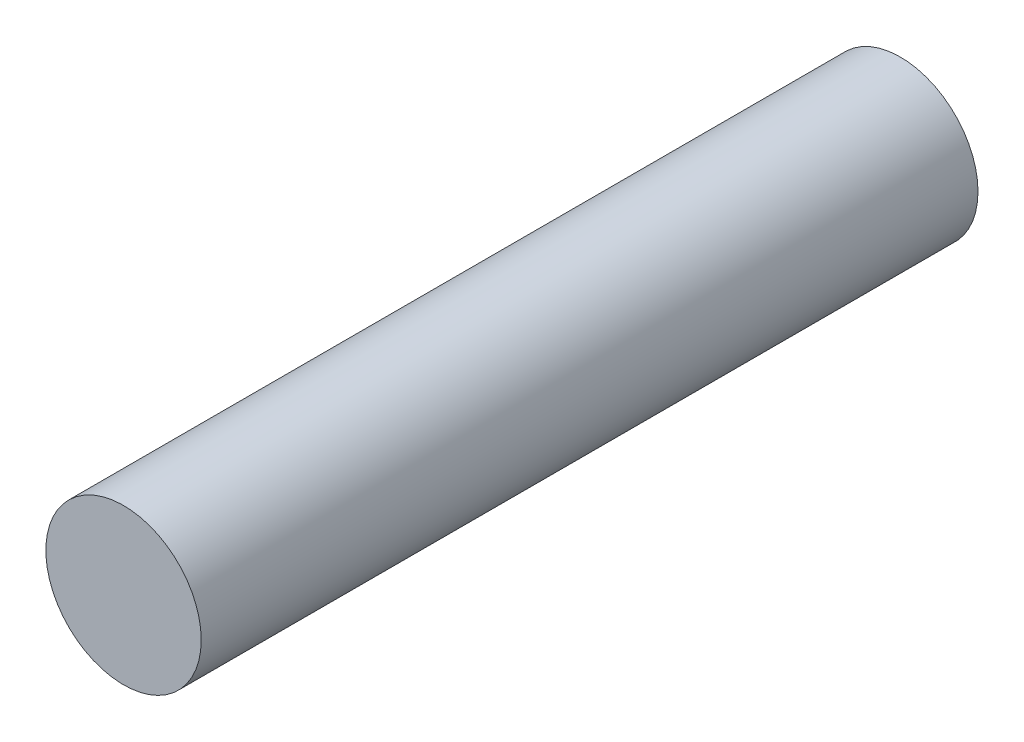
ISO-10303-21;
HEADER;
FILE_DESCRIPTION(('STEP AP214'),'2;1');
FILE_NAME('part.step','',(''),(''),'','','');
FILE_SCHEMA(('AUTOMOTIVE_DESIGN { 1 0 10303 214 1 1 1 1 }'));
ENDSEC;
DATA;
#1=APPLICATION_CONTEXT('core data for automotive mechanical design processes');
#2=APPLICATION_PROTOCOL_DEFINITION('international standard','automotive_design',2000,#1);
#3=PRODUCT_CONTEXT('',#1,'mechanical');
#4=PRODUCT('Part','Part','',(#3));
#5=PRODUCT_RELATED_PRODUCT_CATEGORY('part','',(#4));
#6=PRODUCT_DEFINITION_FORMATION('','',#4);
#7=PRODUCT_DEFINITION_CONTEXT('part definition',#1,'design');
#8=PRODUCT_DEFINITION('design','',#6,#7);
#9=PRODUCT_DEFINITION_SHAPE('','',#8);
#10=(LENGTH_UNIT() NAMED_UNIT(*) SI_UNIT(.MILLI.,.METRE.));
#11=(NAMED_UNIT(*) PLANE_ANGLE_UNIT() SI_UNIT($,.RADIAN.));
#12=(NAMED_UNIT(*) SI_UNIT($,.STERADIAN.) SOLID_ANGLE_UNIT());
#13=UNCERTAINTY_MEASURE_WITH_UNIT(LENGTH_MEASURE(1.E-05),#10,'distance_accuracy_value','');
#14=(GEOMETRIC_REPRESENTATION_CONTEXT(3) GLOBAL_UNCERTAINTY_ASSIGNED_CONTEXT((#13)) GLOBAL_UNIT_ASSIGNED_CONTEXT((#10,
#11,#12)) REPRESENTATION_CONTEXT('',''));
#15=CARTESIAN_POINT('',(0.,0.,0.));
#16=DIRECTION('',(0.,0.,1.));
#17=DIRECTION('',(1.,0.,0.));
#18=AXIS2_PLACEMENT_3D('',#15,#16,#17);
#19=CARTESIAN_POINT('',(0.,0.,5.));
#20=DIRECTION('',(0.,0.,-1.));
#21=DIRECTION('',(-1.,0.,0.));
#22=AXIS2_PLACEMENT_3D('',#19,#20,#21);
#23=CYLINDRICAL_SURFACE('',#22,1.);
#24=CARTESIAN_POINT('',(0.,0.,5.));
#25=DIRECTION('',(0.,0.,1.));
#26=DIRECTION('',(1.,0.,0.));
#27=AXIS2_PLACEMENT_3D('',#24,#25,#26);
#28=CIRCLE('',#27,1.);
#29=CARTESIAN_POINT('',(1.,0.,5.));
#30=VERTEX_POINT('',#29);
#31=EDGE_CURVE('E10',#30,#30,#28,.T.);
#32=ORIENTED_EDGE('',*,*,#31,.F.);
#33=EDGE_LOOP('',(#32));
#34=FACE_BOUND('',#33,.T.);
#35=CARTESIAN_POINT('',(0.,0.,-5.));
#36=DIRECTION('',(0.,0.,1.));
#37=DIRECTION('',(1.,0.,0.));
#38=AXIS2_PLACEMENT_3D('',#35,#36,#37);
#39=CIRCLE('',#38,1.);
#40=CARTESIAN_POINT('',(1.,0.,-5.));
#41=VERTEX_POINT('',#40);
#42=EDGE_CURVE('E46',#41,#41,#39,.T.);
#43=ORIENTED_EDGE('',*,*,#42,.T.);
#44=EDGE_LOOP('',(#43));
#45=FACE_BOUND('',#44,.T.);
#46=ADVANCED_FACE('F43',(#34,#45),#23,.T.);
#47=CARTESIAN_POINT('',(0.,0.,5.));
#48=DIRECTION('',(0.,0.,1.));
#49=DIRECTION('',(1.,0.,0.));
#50=AXIS2_PLACEMENT_3D('',#47,#48,#49);
#51=PLANE('',#50);
#52=ORIENTED_EDGE('',*,*,#31,.T.);
#53=EDGE_LOOP('',(#52));
#54=FACE_BOUND('',#53,.T.);
#55=ADVANCED_FACE('F60',(#54),#51,.T.);
#56=CARTESIAN_POINT('',(0.,0.,-5.));
#57=DIRECTION('',(0.,0.,1.));
#58=DIRECTION('',(1.,0.,0.));
#59=AXIS2_PLACEMENT_3D('',#56,#57,#58);
#60=PLANE('',#59);
#61=ORIENTED_EDGE('',*,*,#42,.F.);
#62=EDGE_LOOP('',(#61));
#63=FACE_BOUND('',#62,.T.);
#64=ADVANCED_FACE('F58',(#63),#60,.F.);
#65=CLOSED_SHELL('',(#46,#55,#64));
#66=MANIFOLD_SOLID_BREP('B2',#65);
#67=ADVANCED_BREP_SHAPE_REPRESENTATION('',(#18,#66),#14);
#68=SHAPE_DEFINITION_REPRESENTATION(#9,#67);
ENDSEC;
END-ISO-10303-21;
